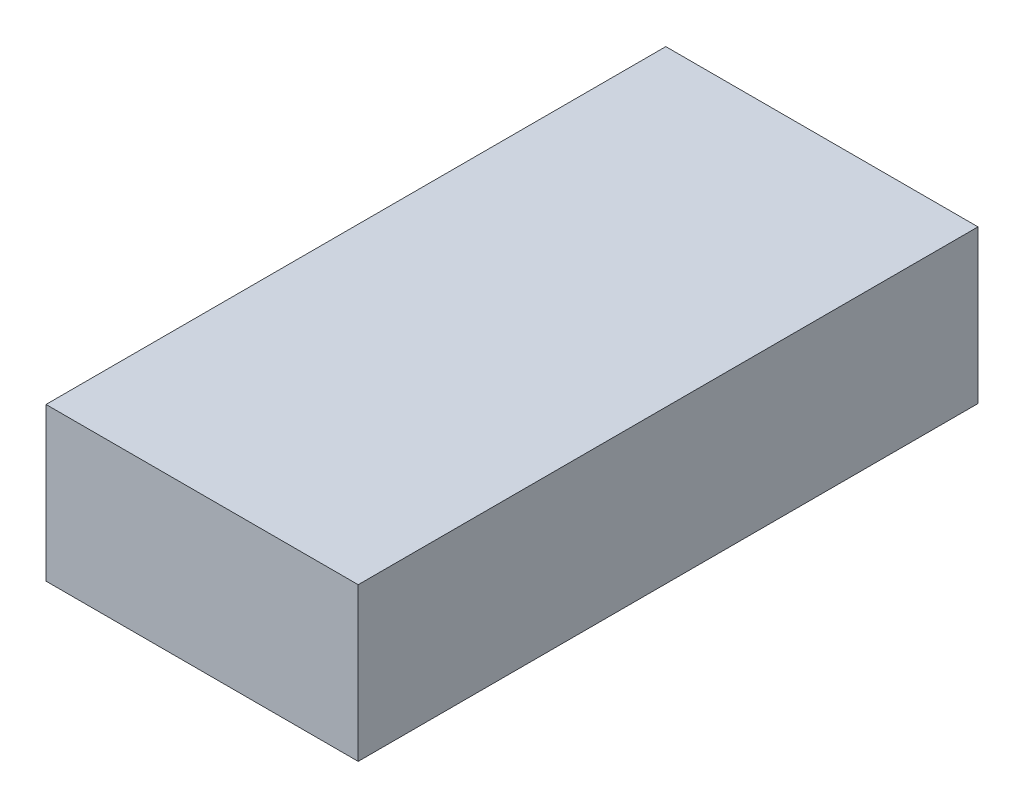
ISO-10303-21;
HEADER;
FILE_DESCRIPTION(('STEP AP214'),'2;1');
FILE_NAME('part.step','',(''),(''),'','','');
FILE_SCHEMA(('AUTOMOTIVE_DESIGN { 1 0 10303 214 1 1 1 1 }'));
ENDSEC;
DATA;
#1=APPLICATION_CONTEXT('core data for automotive mechanical design processes');
#2=APPLICATION_PROTOCOL_DEFINITION('international standard','automotive_design',2000,#1);
#3=PRODUCT_CONTEXT('',#1,'mechanical');
#4=PRODUCT('Part','Part','',(#3));
#5=PRODUCT_RELATED_PRODUCT_CATEGORY('part','',(#4));
#6=PRODUCT_DEFINITION_FORMATION('','',#4);
#7=PRODUCT_DEFINITION_CONTEXT('part definition',#1,'design');
#8=PRODUCT_DEFINITION('design','',#6,#7);
#9=PRODUCT_DEFINITION_SHAPE('','',#8);
#10=(LENGTH_UNIT() NAMED_UNIT(*) SI_UNIT(.MILLI.,.METRE.));
#11=(NAMED_UNIT(*) PLANE_ANGLE_UNIT() SI_UNIT($,.RADIAN.));
#12=(NAMED_UNIT(*) SI_UNIT($,.STERADIAN.) SOLID_ANGLE_UNIT());
#13=UNCERTAINTY_MEASURE_WITH_UNIT(LENGTH_MEASURE(1.E-05),#10,'distance_accuracy_value','');
#14=(GEOMETRIC_REPRESENTATION_CONTEXT(3) GLOBAL_UNCERTAINTY_ASSIGNED_CONTEXT((#13)) GLOBAL_UNIT_ASSIGNED_CONTEXT((#10,
#11,#12)) REPRESENTATION_CONTEXT('',''));
#15=CARTESIAN_POINT('',(0.,0.,0.));
#16=DIRECTION('',(0.,0.,1.));
#17=DIRECTION('',(1.,0.,0.));
#18=AXIS2_PLACEMENT_3D('',#15,#16,#17);
#19=CARTESIAN_POINT('',(12.954,6.35,25.7175));
#20=DIRECTION('',(-1.,0.,0.));
#21=DIRECTION('',(0.,0.,1.));
#22=AXIS2_PLACEMENT_3D('',#19,#20,#21);
#23=PLANE('',#22);
#24=DIRECTION('',(0.,0.,-1.));
#25=VECTOR('',#24,1.);
#26=CARTESIAN_POINT('',(12.954,-6.35,25.7175));
#27=LINE('',#26,#25);
#28=CARTESIAN_POINT('',(12.954,-6.35,25.7175));
#29=VERTEX_POINT('',#28);
#30=CARTESIAN_POINT('',(12.954,-6.35,-25.7175));
#31=VERTEX_POINT('',#30);
#32=EDGE_CURVE('E124',#29,#31,#27,.T.);
#33=ORIENTED_EDGE('',*,*,#32,.T.);
#34=DIRECTION('',(0.,-1.,0.));
#35=VECTOR('',#34,1.);
#36=CARTESIAN_POINT('',(12.954,6.35,-25.7175));
#37=LINE('',#36,#35);
#38=CARTESIAN_POINT('',(12.954,6.35,-25.7175));
#39=VERTEX_POINT('',#38);
#40=EDGE_CURVE('E11',#39,#31,#37,.T.);
#41=ORIENTED_EDGE('',*,*,#40,.F.);
#42=DIRECTION('',(0.,0.,-1.));
#43=VECTOR('',#42,1.);
#44=CARTESIAN_POINT('',(12.954,6.35,25.7175));
#45=LINE('',#44,#43);
#46=CARTESIAN_POINT('',(12.954,6.35,25.7175));
#47=VERTEX_POINT('',#46);
#48=EDGE_CURVE('E108',#47,#39,#45,.T.);
#49=ORIENTED_EDGE('',*,*,#48,.F.);
#50=DIRECTION('',(0.,-1.,0.));
#51=VECTOR('',#50,1.);
#52=CARTESIAN_POINT('',(12.954,6.35,25.7175));
#53=LINE('',#52,#51);
#54=EDGE_CURVE('E120',#47,#29,#53,.T.);
#55=ORIENTED_EDGE('',*,*,#54,.T.);
#56=EDGE_LOOP('',(#33,#41,#49,#55));
#57=FACE_BOUND('',#56,.T.);
#58=ADVANCED_FACE('F49',(#57),#23,.F.);
#59=CARTESIAN_POINT('',(-12.954,6.35,-25.7175));
#60=DIRECTION('',(0.,0.,1.));
#61=DIRECTION('',(1.,0.,0.));
#62=AXIS2_PLACEMENT_3D('',#59,#60,#61);
#63=PLANE('',#62);
#64=DIRECTION('',(-1.,0.,0.));
#65=VECTOR('',#64,1.);
#66=CARTESIAN_POINT('',(-12.954,-6.35,-25.7175));
#67=LINE('',#66,#65);
#68=CARTESIAN_POINT('',(-12.954,-6.35,-25.7175));
#69=VERTEX_POINT('',#68);
#70=EDGE_CURVE('E113',#31,#69,#67,.T.);
#71=ORIENTED_EDGE('',*,*,#70,.T.);
#72=DIRECTION('',(0.,-1.,0.));
#73=VECTOR('',#72,1.);
#74=CARTESIAN_POINT('',(-12.954,6.35,-25.7175));
#75=LINE('',#74,#73);
#76=CARTESIAN_POINT('',(-12.954,6.35,-25.7175));
#77=VERTEX_POINT('',#76);
#78=EDGE_CURVE('E58',#77,#69,#75,.T.);
#79=ORIENTED_EDGE('',*,*,#78,.F.);
#80=DIRECTION('',(-1.,0.,0.));
#81=VECTOR('',#80,1.);
#82=CARTESIAN_POINT('',(-12.954,6.35,-25.7175));
#83=LINE('',#82,#81);
#84=EDGE_CURVE('E103',#39,#77,#83,.T.);
#85=ORIENTED_EDGE('',*,*,#84,.F.);
#86=ORIENTED_EDGE('',*,*,#40,.T.);
#87=EDGE_LOOP('',(#71,#79,#85,#86));
#88=FACE_BOUND('',#87,.T.);
#89=ADVANCED_FACE('F112',(#88),#63,.F.);
#90=CARTESIAN_POINT('',(-12.954,6.35,25.7175));
#91=DIRECTION('',(1.,0.,0.));
#92=DIRECTION('',(0.,0.,-1.));
#93=AXIS2_PLACEMENT_3D('',#90,#91,#92);
#94=PLANE('',#93);
#95=DIRECTION('',(0.,0.,1.));
#96=VECTOR('',#95,1.);
#97=CARTESIAN_POINT('',(-12.954,-6.35,25.7175));
#98=LINE('',#97,#96);
#99=CARTESIAN_POINT('',(-12.954,-6.35,25.7175));
#100=VERTEX_POINT('',#99);
#101=EDGE_CURVE('E89',#69,#100,#98,.T.);
#102=ORIENTED_EDGE('',*,*,#101,.T.);
#103=DIRECTION('',(0.,-1.,0.));
#104=VECTOR('',#103,1.);
#105=CARTESIAN_POINT('',(-12.954,6.35,25.7175));
#106=LINE('',#105,#104);
#107=CARTESIAN_POINT('',(-12.954,6.35,25.7175));
#108=VERTEX_POINT('',#107);
#109=EDGE_CURVE('E115',#108,#100,#106,.T.);
#110=ORIENTED_EDGE('',*,*,#109,.F.);
#111=DIRECTION('',(0.,0.,1.));
#112=VECTOR('',#111,1.);
#113=CARTESIAN_POINT('',(-12.954,6.35,25.7175));
#114=LINE('',#113,#112);
#115=EDGE_CURVE('E106',#77,#108,#114,.T.);
#116=ORIENTED_EDGE('',*,*,#115,.F.);
#117=ORIENTED_EDGE('',*,*,#78,.T.);
#118=EDGE_LOOP('',(#102,#110,#116,#117));
#119=FACE_BOUND('',#118,.T.);
#120=ADVANCED_FACE('F116',(#119),#94,.F.);
#121=CARTESIAN_POINT('',(-12.954,6.35,25.7175));
#122=DIRECTION('',(0.,0.,-1.));
#123=DIRECTION('',(-1.,0.,0.));
#124=AXIS2_PLACEMENT_3D('',#121,#122,#123);
#125=PLANE('',#124);
#126=DIRECTION('',(1.,0.,0.));
#127=VECTOR('',#126,1.);
#128=CARTESIAN_POINT('',(-12.954,-6.35,25.7175));
#129=LINE('',#128,#127);
#130=EDGE_CURVE('E96',#100,#29,#129,.T.);
#131=ORIENTED_EDGE('',*,*,#130,.T.);
#132=ORIENTED_EDGE('',*,*,#54,.F.);
#133=DIRECTION('',(1.,0.,0.));
#134=VECTOR('',#133,1.);
#135=CARTESIAN_POINT('',(-12.954,6.35,25.7175));
#136=LINE('',#135,#134);
#137=EDGE_CURVE('E69',#108,#47,#136,.T.);
#138=ORIENTED_EDGE('',*,*,#137,.F.);
#139=ORIENTED_EDGE('',*,*,#109,.T.);
#140=EDGE_LOOP('',(#131,#132,#138,#139));
#141=FACE_BOUND('',#140,.T.);
#142=ADVANCED_FACE('F137',(#141),#125,.F.);
#143=CARTESIAN_POINT('',(0.,6.35,0.));
#144=DIRECTION('',(0.,-1.,0.));
#145=DIRECTION('',(0.,0.,-1.));
#146=AXIS2_PLACEMENT_3D('',#143,#144,#145);
#147=PLANE('',#146);
#148=ORIENTED_EDGE('',*,*,#48,.T.);
#149=ORIENTED_EDGE('',*,*,#84,.T.);
#150=ORIENTED_EDGE('',*,*,#115,.T.);
#151=ORIENTED_EDGE('',*,*,#137,.T.);
#152=EDGE_LOOP('',(#148,#149,#150,#151));
#153=FACE_BOUND('',#152,.T.);
#154=ADVANCED_FACE('F104',(#153),#147,.F.);
#155=CARTESIAN_POINT('',(0.,-6.35,0.));
#156=DIRECTION('',(0.,-1.,0.));
#157=DIRECTION('',(0.,0.,-1.));
#158=AXIS2_PLACEMENT_3D('',#155,#156,#157);
#159=PLANE('',#158);
#160=ORIENTED_EDGE('',*,*,#32,.F.);
#161=ORIENTED_EDGE('',*,*,#130,.F.);
#162=ORIENTED_EDGE('',*,*,#101,.F.);
#163=ORIENTED_EDGE('',*,*,#70,.F.);
#164=EDGE_LOOP('',(#160,#161,#162,#163));
#165=FACE_BOUND('',#164,.T.);
#166=ADVANCED_FACE('F140',(#165),#159,.T.);
#167=CLOSED_SHELL('',(#58,#89,#120,#142,#154,#166));
#168=MANIFOLD_SOLID_BREP('B2',#167);
#169=ADVANCED_BREP_SHAPE_REPRESENTATION('',(#18,#168),#14);
#170=SHAPE_DEFINITION_REPRESENTATION(#9,#169);
ENDSEC;
END-ISO-10303-21;
